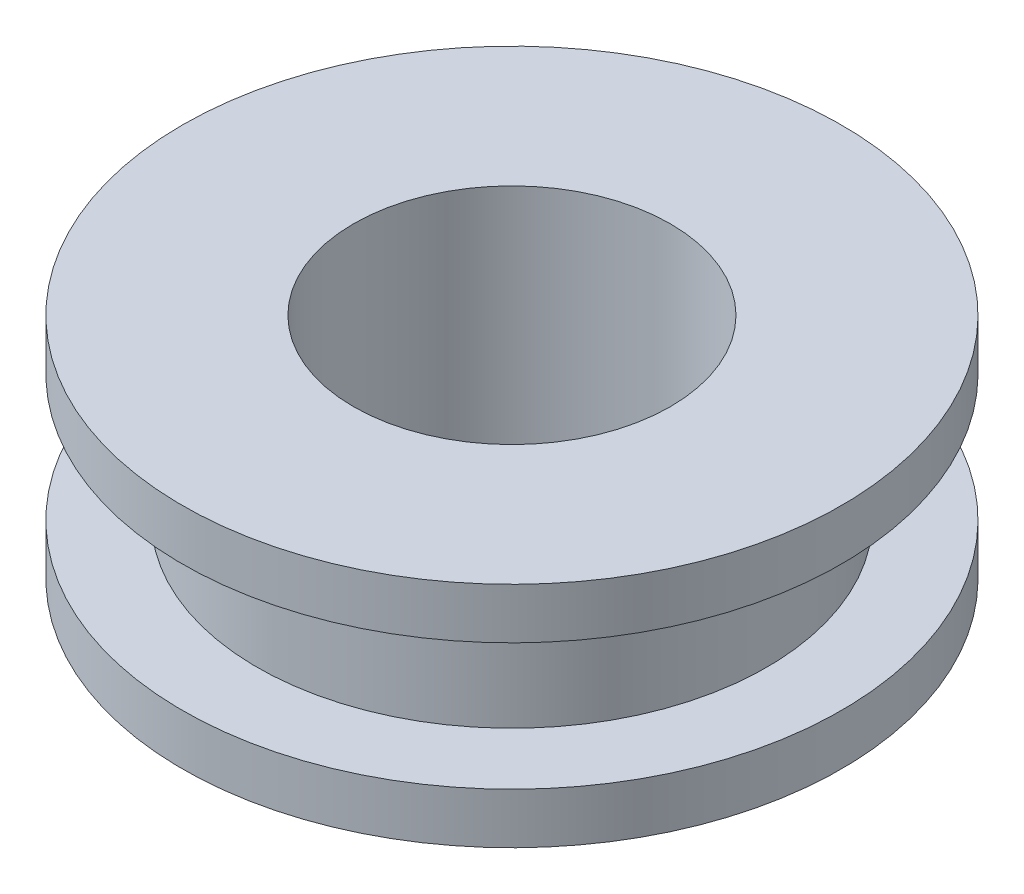
ISO-10303-21;
HEADER;
FILE_DESCRIPTION(('STEP AP214'),'2;1');
FILE_NAME('part.step','',(''),(''),'','','');
FILE_SCHEMA(('AUTOMOTIVE_DESIGN { 1 0 10303 214 1 1 1 1 }'));
ENDSEC;
DATA;
#1=APPLICATION_CONTEXT('core data for automotive mechanical design processes');
#2=APPLICATION_PROTOCOL_DEFINITION('international standard','automotive_design',2000,#1);
#3=PRODUCT_CONTEXT('',#1,'mechanical');
#4=PRODUCT('Part','Part','',(#3));
#5=PRODUCT_RELATED_PRODUCT_CATEGORY('part','',(#4));
#6=PRODUCT_DEFINITION_FORMATION('','',#4);
#7=PRODUCT_DEFINITION_CONTEXT('part definition',#1,'design');
#8=PRODUCT_DEFINITION('design','',#6,#7);
#9=PRODUCT_DEFINITION_SHAPE('','',#8);
#10=(LENGTH_UNIT() NAMED_UNIT(*) SI_UNIT(.MILLI.,.METRE.));
#11=(NAMED_UNIT(*) PLANE_ANGLE_UNIT() SI_UNIT($,.RADIAN.));
#12=(NAMED_UNIT(*) SI_UNIT($,.STERADIAN.) SOLID_ANGLE_UNIT());
#13=UNCERTAINTY_MEASURE_WITH_UNIT(LENGTH_MEASURE(1.E-05),#10,'distance_accuracy_value','');
#14=(GEOMETRIC_REPRESENTATION_CONTEXT(3) GLOBAL_UNCERTAINTY_ASSIGNED_CONTEXT((#13)) GLOBAL_UNIT_ASSIGNED_CONTEXT((#10,
#11,#12)) REPRESENTATION_CONTEXT('',''));
#15=CARTESIAN_POINT('',(0.,0.,0.));
#16=DIRECTION('',(0.,0.,1.));
#17=DIRECTION('',(1.,0.,0.));
#18=AXIS2_PLACEMENT_3D('',#15,#16,#17);
#19=CARTESIAN_POINT('',(0.,0.,0.));
#20=DIRECTION('',(0.,1.,0.));
#21=DIRECTION('',(-1.,0.,0.));
#22=AXIS2_PLACEMENT_3D('',#19,#20,#21);
#23=PLANE('',#22);
#24=CARTESIAN_POINT('',(0.,0.,0.));
#25=DIRECTION('',(0.,1.,0.));
#26=DIRECTION('',(-1.,0.,0.));
#27=AXIS2_PLACEMENT_3D('',#24,#25,#26);
#28=CIRCLE('',#27,25.);
#29=CARTESIAN_POINT('',(-25.,0.,0.));
#30=VERTEX_POINT('',#29);
#31=EDGE_CURVE('E44',#30,#30,#28,.T.);
#32=ORIENTED_EDGE('',*,*,#31,.T.);
#33=EDGE_LOOP('',(#32));
#34=FACE_BOUND('',#33,.T.);
#35=CARTESIAN_POINT('',(0.,0.,0.));
#36=DIRECTION('',(0.,1.,0.));
#37=DIRECTION('',(-1.,0.,0.));
#38=AXIS2_PLACEMENT_3D('',#35,#36,#37);
#39=CIRCLE('',#38,52.);
#40=CARTESIAN_POINT('',(-52.,0.,0.));
#41=VERTEX_POINT('',#40);
#42=EDGE_CURVE('E10',#41,#41,#39,.T.);
#43=ORIENTED_EDGE('',*,*,#42,.F.);
#44=EDGE_LOOP('',(#43));
#45=FACE_BOUND('',#44,.T.);
#46=ADVANCED_FACE('F41',(#34,#45),#23,.F.);
#47=CARTESIAN_POINT('',(0.,36.,0.));
#48=DIRECTION('',(0.,1.,0.));
#49=DIRECTION('',(-1.,0.,0.));
#50=AXIS2_PLACEMENT_3D('',#47,#48,#49);
#51=CYLINDRICAL_SURFACE('',#50,52.);
#52=CARTESIAN_POINT('',(0.,8.,0.));
#53=DIRECTION('',(0.,1.,0.));
#54=DIRECTION('',(-1.,0.,0.));
#55=AXIS2_PLACEMENT_3D('',#52,#53,#54);
#56=CIRCLE('',#55,52.);
#57=CARTESIAN_POINT('',(-52.,8.,0.));
#58=VERTEX_POINT('',#57);
#59=EDGE_CURVE('E49',#58,#58,#56,.T.);
#60=ORIENTED_EDGE('',*,*,#59,.F.);
#61=EDGE_LOOP('',(#60));
#62=FACE_BOUND('',#61,.T.);
#63=ORIENTED_EDGE('',*,*,#42,.T.);
#64=EDGE_LOOP('',(#63));
#65=FACE_BOUND('',#64,.T.);
#66=ADVANCED_FACE('F94',(#62,#65),#51,.T.);
#67=CARTESIAN_POINT('',(52.,8.,0.));
#68=DIRECTION('',(0.,-1.,0.));
#69=DIRECTION('',(1.,0.,0.));
#70=AXIS2_PLACEMENT_3D('',#67,#68,#69);
#71=PLANE('',#70);
#72=CARTESIAN_POINT('',(0.,8.,0.));
#73=DIRECTION('',(0.,1.,0.));
#74=DIRECTION('',(-1.,0.,0.));
#75=AXIS2_PLACEMENT_3D('',#72,#73,#74);
#76=CIRCLE('',#75,40.2167487684729);
#77=CARTESIAN_POINT('',(-40.2167487684729,8.,0.));
#78=VERTEX_POINT('',#77);
#79=EDGE_CURVE('E54',#78,#78,#76,.T.);
#80=ORIENTED_EDGE('',*,*,#79,.F.);
#81=EDGE_LOOP('',(#80));
#82=FACE_BOUND('',#81,.T.);
#83=ORIENTED_EDGE('',*,*,#59,.T.);
#84=EDGE_LOOP('',(#83));
#85=FACE_BOUND('',#84,.T.);
#86=ADVANCED_FACE('F98',(#82,#85),#71,.F.);
#87=CARTESIAN_POINT('',(0.,36.,0.));
#88=DIRECTION('',(0.,1.,0.));
#89=DIRECTION('',(-1.,0.,0.));
#90=AXIS2_PLACEMENT_3D('',#87,#88,#89);
#91=CYLINDRICAL_SURFACE('',#90,40.2167487684729);
#92=CARTESIAN_POINT('',(0.,28.,0.));
#93=DIRECTION('',(0.,1.,0.));
#94=DIRECTION('',(-1.,0.,0.));
#95=AXIS2_PLACEMENT_3D('',#92,#93,#94);
#96=CIRCLE('',#95,40.2167487684729);
#97=CARTESIAN_POINT('',(-40.2167487684729,28.,0.));
#98=VERTEX_POINT('',#97);
#99=EDGE_CURVE('E60',#98,#98,#96,.T.);
#100=ORIENTED_EDGE('',*,*,#99,.F.);
#101=EDGE_LOOP('',(#100));
#102=FACE_BOUND('',#101,.T.);
#103=ORIENTED_EDGE('',*,*,#79,.T.);
#104=EDGE_LOOP('',(#103));
#105=FACE_BOUND('',#104,.T.);
#106=ADVANCED_FACE('F103',(#102,#105),#91,.T.);
#107=CARTESIAN_POINT('',(40.2167487684729,28.,0.));
#108=DIRECTION('',(0.,1.,0.));
#109=DIRECTION('',(-1.,0.,0.));
#110=AXIS2_PLACEMENT_3D('',#107,#108,#109);
#111=PLANE('',#110);
#112=CARTESIAN_POINT('',(0.,28.,0.));
#113=DIRECTION('',(0.,1.,0.));
#114=DIRECTION('',(-1.,0.,0.));
#115=AXIS2_PLACEMENT_3D('',#112,#113,#114);
#116=CIRCLE('',#115,52.);
#117=CARTESIAN_POINT('',(-52.,28.,0.));
#118=VERTEX_POINT('',#117);
#119=EDGE_CURVE('E64',#118,#118,#116,.T.);
#120=ORIENTED_EDGE('',*,*,#119,.F.);
#121=EDGE_LOOP('',(#120));
#122=FACE_BOUND('',#121,.T.);
#123=ORIENTED_EDGE('',*,*,#99,.T.);
#124=EDGE_LOOP('',(#123));
#125=FACE_BOUND('',#124,.T.);
#126=ADVANCED_FACE('F110',(#122,#125),#111,.F.);
#127=CARTESIAN_POINT('',(0.,36.,0.));
#128=DIRECTION('',(0.,1.,0.));
#129=DIRECTION('',(-1.,0.,0.));
#130=AXIS2_PLACEMENT_3D('',#127,#128,#129);
#131=CYLINDRICAL_SURFACE('',#130,52.);
#132=CARTESIAN_POINT('',(0.,36.,0.));
#133=DIRECTION('',(0.,1.,0.));
#134=DIRECTION('',(-1.,0.,0.));
#135=AXIS2_PLACEMENT_3D('',#132,#133,#134);
#136=CIRCLE('',#135,52.);
#137=CARTESIAN_POINT('',(-52.,36.,0.));
#138=VERTEX_POINT('',#137);
#139=EDGE_CURVE('E68',#138,#138,#136,.T.);
#140=ORIENTED_EDGE('',*,*,#139,.F.);
#141=EDGE_LOOP('',(#140));
#142=FACE_BOUND('',#141,.T.);
#143=ORIENTED_EDGE('',*,*,#119,.T.);
#144=EDGE_LOOP('',(#143));
#145=FACE_BOUND('',#144,.T.);
#146=ADVANCED_FACE('F90',(#142,#145),#131,.T.);
#147=CARTESIAN_POINT('',(52.,36.,0.));
#148=DIRECTION('',(0.,-1.,0.));
#149=DIRECTION('',(1.,0.,0.));
#150=AXIS2_PLACEMENT_3D('',#147,#148,#149);
#151=PLANE('',#150);
#152=CARTESIAN_POINT('',(0.,36.,0.));
#153=DIRECTION('',(0.,1.,0.));
#154=DIRECTION('',(-1.,0.,0.));
#155=AXIS2_PLACEMENT_3D('',#152,#153,#154);
#156=CIRCLE('',#155,25.);
#157=CARTESIAN_POINT('',(-25.,36.,0.));
#158=VERTEX_POINT('',#157);
#159=EDGE_CURVE('E72',#158,#158,#156,.T.);
#160=ORIENTED_EDGE('',*,*,#159,.F.);
#161=EDGE_LOOP('',(#160));
#162=FACE_BOUND('',#161,.T.);
#163=ORIENTED_EDGE('',*,*,#139,.T.);
#164=EDGE_LOOP('',(#163));
#165=FACE_BOUND('',#164,.T.);
#166=ADVANCED_FACE('F85',(#162,#165),#151,.F.);
#167=CARTESIAN_POINT('',(0.,26.,0.));
#168=DIRECTION('',(0.,1.,0.));
#169=DIRECTION('',(-1.,0.,0.));
#170=AXIS2_PLACEMENT_3D('',#167,#168,#169);
#171=CYLINDRICAL_SURFACE('',#170,25.);
#172=ORIENTED_EDGE('',*,*,#159,.T.);
#173=EDGE_LOOP('',(#172));
#174=FACE_BOUND('',#173,.T.);
#175=ORIENTED_EDGE('',*,*,#31,.F.);
#176=EDGE_LOOP('',(#175));
#177=FACE_BOUND('',#176,.T.);
#178=ADVANCED_FACE('F83',(#174,#177),#171,.F.);
#179=CLOSED_SHELL('',(#46,#66,#86,#106,#126,#146,#166,#178));
#180=MANIFOLD_SOLID_BREP('B2',#179);
#181=ADVANCED_BREP_SHAPE_REPRESENTATION('',(#18,#180),#14);
#182=SHAPE_DEFINITION_REPRESENTATION(#9,#181);
ENDSEC;
END-ISO-10303-21;
